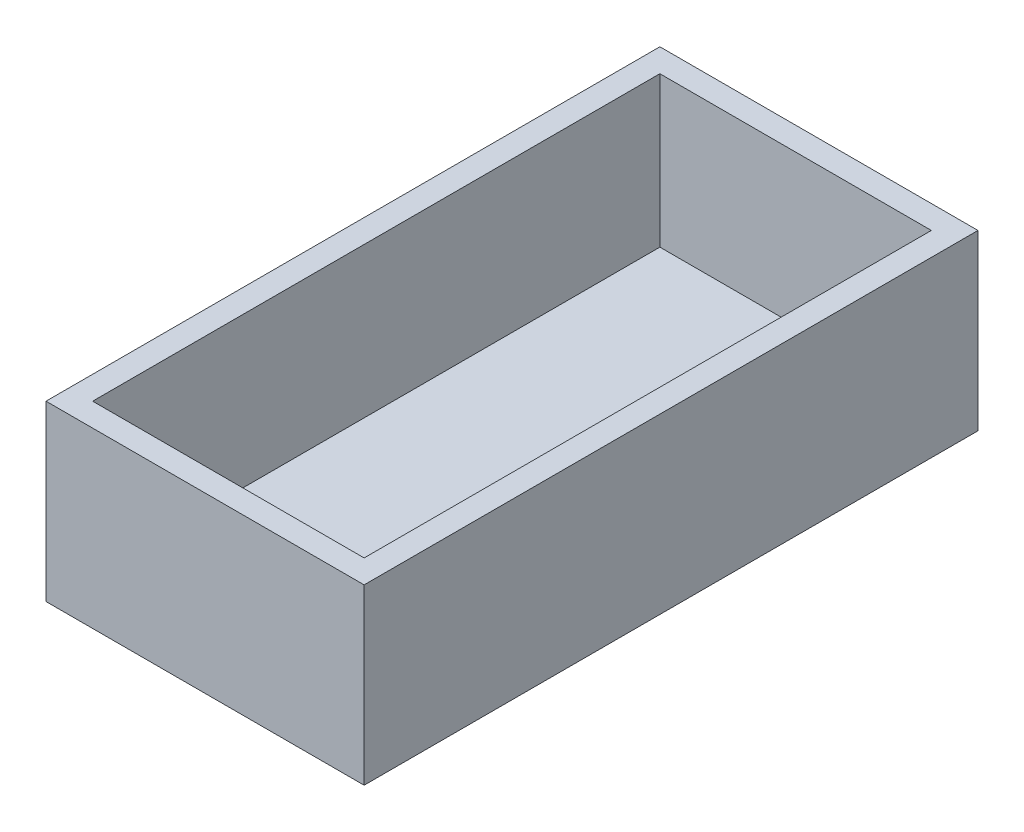
ISO-10303-21;
HEADER;
FILE_DESCRIPTION(('STEP AP214'),'2;1');
FILE_NAME('part.step','',(''),(''),'','','');
FILE_SCHEMA(('AUTOMOTIVE_DESIGN { 1 0 10303 214 1 1 1 1 }'));
ENDSEC;
DATA;
#1=APPLICATION_CONTEXT('core data for automotive mechanical design processes');
#2=APPLICATION_PROTOCOL_DEFINITION('international standard','automotive_design',2000,#1);
#3=PRODUCT_CONTEXT('',#1,'mechanical');
#4=PRODUCT('Part','Part','',(#3));
#5=PRODUCT_RELATED_PRODUCT_CATEGORY('part','',(#4));
#6=PRODUCT_DEFINITION_FORMATION('','',#4);
#7=PRODUCT_DEFINITION_CONTEXT('part definition',#1,'design');
#8=PRODUCT_DEFINITION('design','',#6,#7);
#9=PRODUCT_DEFINITION_SHAPE('','',#8);
#10=(LENGTH_UNIT() NAMED_UNIT(*) SI_UNIT(.MILLI.,.METRE.));
#11=(NAMED_UNIT(*) PLANE_ANGLE_UNIT() SI_UNIT($,.RADIAN.));
#12=(NAMED_UNIT(*) SI_UNIT($,.STERADIAN.) SOLID_ANGLE_UNIT());
#13=UNCERTAINTY_MEASURE_WITH_UNIT(LENGTH_MEASURE(1.E-05),#10,'distance_accuracy_value','');
#14=(GEOMETRIC_REPRESENTATION_CONTEXT(3) GLOBAL_UNCERTAINTY_ASSIGNED_CONTEXT((#13)) GLOBAL_UNIT_ASSIGNED_CONTEXT((#10,
#11,#12)) REPRESENTATION_CONTEXT('',''));
#15=CARTESIAN_POINT('',(0.,0.,0.));
#16=DIRECTION('',(0.,0.,1.));
#17=DIRECTION('',(1.,0.,0.));
#18=AXIS2_PLACEMENT_3D('',#15,#16,#17);
#19=CARTESIAN_POINT('',(0.,23.622,0.));
#20=DIRECTION('',(0.,-1.,0.));
#21=DIRECTION('',(0.,0.,-1.));
#22=AXIS2_PLACEMENT_3D('',#19,#20,#21);
#23=PLANE('',#22);
#24=DIRECTION('',(1.,0.,0.));
#25=VECTOR('',#24,1.);
#26=CARTESIAN_POINT('',(20.066,23.622,41.783));
#27=LINE('',#26,#25);
#28=CARTESIAN_POINT('',(-23.241,23.622,41.783));
#29=VERTEX_POINT('',#28);
#30=CARTESIAN_POINT('',(20.066,23.622,41.783));
#31=VERTEX_POINT('',#30);
#32=EDGE_CURVE('E165',#29,#31,#27,.T.);
#33=ORIENTED_EDGE('',*,*,#32,.T.);
#34=DIRECTION('',(0.,0.,-1.));
#35=VECTOR('',#34,1.);
#36=CARTESIAN_POINT('',(20.066,23.622,41.783));
#37=LINE('',#36,#35);
#38=CARTESIAN_POINT('',(20.066,23.622,-41.783));
#39=VERTEX_POINT('',#38);
#40=EDGE_CURVE('E100',#31,#39,#37,.T.);
#41=ORIENTED_EDGE('',*,*,#40,.T.);
#42=DIRECTION('',(-1.,0.,0.));
#43=VECTOR('',#42,1.);
#44=CARTESIAN_POINT('',(20.066,23.622,-41.783));
#45=LINE('',#44,#43);
#46=CARTESIAN_POINT('',(-23.241,23.622,-41.783));
#47=VERTEX_POINT('',#46);
#48=EDGE_CURVE('E170',#39,#47,#45,.T.);
#49=ORIENTED_EDGE('',*,*,#48,.T.);
#50=DIRECTION('',(0.,0.,1.));
#51=VECTOR('',#50,1.);
#52=CARTESIAN_POINT('',(-23.241,23.622,41.783));
#53=LINE('',#52,#51);
#54=EDGE_CURVE('E72',#47,#29,#53,.T.);
#55=ORIENTED_EDGE('',*,*,#54,.T.);
#56=EDGE_LOOP('',(#33,#41,#49,#55));
#57=FACE_BOUND('',#56,.T.);
#58=DIRECTION('',(1.,0.,0.));
#59=VECTOR('',#58,1.);
#60=CARTESIAN_POINT('',(0.,23.622,38.608));
#61=LINE('',#60,#59);
#62=CARTESIAN_POINT('',(-20.066,23.622,38.608));
#63=VERTEX_POINT('',#62);
#64=CARTESIAN_POINT('',(16.891,23.622,38.608));
#65=VERTEX_POINT('',#64);
#66=EDGE_CURVE('E149',#63,#65,#61,.T.);
#67=ORIENTED_EDGE('',*,*,#66,.F.);
#68=DIRECTION('',(0.,0.,1.));
#69=VECTOR('',#68,1.);
#70=CARTESIAN_POINT('',(-20.066,23.622,0.));
#71=LINE('',#70,#69);
#72=CARTESIAN_POINT('',(-20.066,23.622,-38.608));
#73=VERTEX_POINT('',#72);
#74=EDGE_CURVE('E162',#73,#63,#71,.T.);
#75=ORIENTED_EDGE('',*,*,#74,.F.);
#76=DIRECTION('',(-1.,0.,0.));
#77=VECTOR('',#76,1.);
#78=CARTESIAN_POINT('',(0.,23.622,-38.608));
#79=LINE('',#78,#77);
#80=CARTESIAN_POINT('',(16.891,23.622,-38.608));
#81=VERTEX_POINT('',#80);
#82=EDGE_CURVE('E159',#81,#73,#79,.T.);
#83=ORIENTED_EDGE('',*,*,#82,.F.);
#84=DIRECTION('',(0.,0.,-1.));
#85=VECTOR('',#84,1.);
#86=CARTESIAN_POINT('',(16.891,23.622,0.));
#87=LINE('',#86,#85);
#88=EDGE_CURVE('E138',#65,#81,#87,.T.);
#89=ORIENTED_EDGE('',*,*,#88,.F.);
#90=EDGE_LOOP('',(#67,#75,#83,#89));
#91=FACE_BOUND('',#90,.T.);
#92=ADVANCED_FACE('F47',(#57,#91),#23,.F.);
#93=CARTESIAN_POINT('',(20.066,23.622,41.783));
#94=DIRECTION('',(0.,0.,-1.));
#95=DIRECTION('',(-1.,0.,0.));
#96=AXIS2_PLACEMENT_3D('',#93,#94,#95);
#97=PLANE('',#96);
#98=DIRECTION('',(1.,0.,0.));
#99=VECTOR('',#98,1.);
#100=CARTESIAN_POINT('',(20.066,0.,41.783));
#101=LINE('',#100,#99);
#102=CARTESIAN_POINT('',(-23.241,0.,41.783));
#103=VERTEX_POINT('',#102);
#104=CARTESIAN_POINT('',(20.066,0.,41.783));
#105=VERTEX_POINT('',#104);
#106=EDGE_CURVE('E176',#103,#105,#101,.T.);
#107=ORIENTED_EDGE('',*,*,#106,.T.);
#108=DIRECTION('',(0.,-1.,0.));
#109=VECTOR('',#108,1.);
#110=CARTESIAN_POINT('',(20.066,23.622,41.783));
#111=LINE('',#110,#109);
#112=EDGE_CURVE('E11',#31,#105,#111,.T.);
#113=ORIENTED_EDGE('',*,*,#112,.F.);
#114=ORIENTED_EDGE('',*,*,#32,.F.);
#115=DIRECTION('',(0.,-1.,0.));
#116=VECTOR('',#115,1.);
#117=CARTESIAN_POINT('',(-23.241,23.622,41.783));
#118=LINE('',#117,#116);
#119=EDGE_CURVE('E175',#29,#103,#118,.T.);
#120=ORIENTED_EDGE('',*,*,#119,.T.);
#121=EDGE_LOOP('',(#107,#113,#114,#120));
#122=FACE_BOUND('',#121,.T.);
#123=ADVANCED_FACE('F49',(#122),#97,.F.);
#124=CARTESIAN_POINT('',(20.066,23.622,41.783));
#125=DIRECTION('',(-1.,0.,0.));
#126=DIRECTION('',(0.,0.,1.));
#127=AXIS2_PLACEMENT_3D('',#124,#125,#126);
#128=PLANE('',#127);
#129=DIRECTION('',(0.,0.,-1.));
#130=VECTOR('',#129,1.);
#131=CARTESIAN_POINT('',(20.066,0.,41.783));
#132=LINE('',#131,#130);
#133=CARTESIAN_POINT('',(20.066,0.,-41.783));
#134=VERTEX_POINT('',#133);
#135=EDGE_CURVE('E180',#105,#134,#132,.T.);
#136=ORIENTED_EDGE('',*,*,#135,.T.);
#137=DIRECTION('',(0.,-1.,0.));
#138=VECTOR('',#137,1.);
#139=CARTESIAN_POINT('',(20.066,23.622,-41.783));
#140=LINE('',#139,#138);
#141=EDGE_CURVE('E56',#39,#134,#140,.T.);
#142=ORIENTED_EDGE('',*,*,#141,.F.);
#143=ORIENTED_EDGE('',*,*,#40,.F.);
#144=ORIENTED_EDGE('',*,*,#112,.T.);
#145=EDGE_LOOP('',(#136,#142,#143,#144));
#146=FACE_BOUND('',#145,.T.);
#147=ADVANCED_FACE('F214',(#146),#128,.F.);
#148=CARTESIAN_POINT('',(20.066,23.622,-41.783));
#149=DIRECTION('',(0.,0.,1.));
#150=DIRECTION('',(1.,0.,0.));
#151=AXIS2_PLACEMENT_3D('',#148,#149,#150);
#152=PLANE('',#151);
#153=DIRECTION('',(-1.,0.,0.));
#154=VECTOR('',#153,1.);
#155=CARTESIAN_POINT('',(20.066,0.,-41.783));
#156=LINE('',#155,#154);
#157=CARTESIAN_POINT('',(-23.241,0.,-41.783));
#158=VERTEX_POINT('',#157);
#159=EDGE_CURVE('E183',#134,#158,#156,.T.);
#160=ORIENTED_EDGE('',*,*,#159,.T.);
#161=DIRECTION('',(0.,-1.,0.));
#162=VECTOR('',#161,1.);
#163=CARTESIAN_POINT('',(-23.241,23.622,-41.783));
#164=LINE('',#163,#162);
#165=EDGE_CURVE('E190',#47,#158,#164,.T.);
#166=ORIENTED_EDGE('',*,*,#165,.F.);
#167=ORIENTED_EDGE('',*,*,#48,.F.);
#168=ORIENTED_EDGE('',*,*,#141,.T.);
#169=EDGE_LOOP('',(#160,#166,#167,#168));
#170=FACE_BOUND('',#169,.T.);
#171=ADVANCED_FACE('F197',(#170),#152,.F.);
#172=CARTESIAN_POINT('',(-23.241,23.622,41.783));
#173=DIRECTION('',(1.,0.,0.));
#174=DIRECTION('',(0.,0.,-1.));
#175=AXIS2_PLACEMENT_3D('',#172,#173,#174);
#176=PLANE('',#175);
#177=DIRECTION('',(0.,0.,1.));
#178=VECTOR('',#177,1.);
#179=CARTESIAN_POINT('',(-23.241,0.,41.783));
#180=LINE('',#179,#178);
#181=EDGE_CURVE('E93',#158,#103,#180,.T.);
#182=ORIENTED_EDGE('',*,*,#181,.T.);
#183=ORIENTED_EDGE('',*,*,#119,.F.);
#184=ORIENTED_EDGE('',*,*,#54,.F.);
#185=ORIENTED_EDGE('',*,*,#165,.T.);
#186=EDGE_LOOP('',(#182,#183,#184,#185));
#187=FACE_BOUND('',#186,.T.);
#188=ADVANCED_FACE('F205',(#187),#176,.F.);
#189=CARTESIAN_POINT('',(0.,0.,0.));
#190=DIRECTION('',(0.,-1.,0.));
#191=DIRECTION('',(0.,0.,-1.));
#192=AXIS2_PLACEMENT_3D('',#189,#190,#191);
#193=PLANE('',#192);
#194=ORIENTED_EDGE('',*,*,#106,.F.);
#195=ORIENTED_EDGE('',*,*,#181,.F.);
#196=ORIENTED_EDGE('',*,*,#159,.F.);
#197=ORIENTED_EDGE('',*,*,#135,.F.);
#198=EDGE_LOOP('',(#194,#195,#196,#197));
#199=FACE_BOUND('',#198,.T.);
#200=ADVANCED_FACE('F201',(#199),#193,.T.);
#201=CARTESIAN_POINT('',(20.066,23.622,38.608));
#202=DIRECTION('',(0.,0.,-1.));
#203=DIRECTION('',(-1.,0.,0.));
#204=AXIS2_PLACEMENT_3D('',#201,#202,#203);
#205=PLANE('',#204);
#206=DIRECTION('',(1.,0.,0.));
#207=VECTOR('',#206,1.);
#208=CARTESIAN_POINT('',(0.,3.175,38.608));
#209=LINE('',#208,#207);
#210=CARTESIAN_POINT('',(-20.066,3.175,38.608));
#211=VERTEX_POINT('',#210);
#212=CARTESIAN_POINT('',(16.891,3.175,38.608));
#213=VERTEX_POINT('',#212);
#214=EDGE_CURVE('E128',#211,#213,#209,.T.);
#215=ORIENTED_EDGE('',*,*,#214,.F.);
#216=DIRECTION('',(0.,-1.,0.));
#217=VECTOR('',#216,1.);
#218=CARTESIAN_POINT('',(-20.066,23.622,38.608));
#219=LINE('',#218,#217);
#220=EDGE_CURVE('E153',#63,#211,#219,.T.);
#221=ORIENTED_EDGE('',*,*,#220,.F.);
#222=ORIENTED_EDGE('',*,*,#66,.T.);
#223=DIRECTION('',(0.,-1.,0.));
#224=VECTOR('',#223,1.);
#225=CARTESIAN_POINT('',(16.891,23.622,38.608));
#226=LINE('',#225,#224);
#227=EDGE_CURVE('E142',#65,#213,#226,.T.);
#228=ORIENTED_EDGE('',*,*,#227,.T.);
#229=EDGE_LOOP('',(#215,#221,#222,#228));
#230=FACE_BOUND('',#229,.T.);
#231=ADVANCED_FACE('F212',(#230),#205,.T.);
#232=CARTESIAN_POINT('',(16.891,23.622,41.783));
#233=DIRECTION('',(-1.,0.,0.));
#234=DIRECTION('',(0.,0.,1.));
#235=AXIS2_PLACEMENT_3D('',#232,#233,#234);
#236=PLANE('',#235);
#237=DIRECTION('',(0.,0.,-1.));
#238=VECTOR('',#237,1.);
#239=CARTESIAN_POINT('',(16.891,3.175,0.));
#240=LINE('',#239,#238);
#241=CARTESIAN_POINT('',(16.891,3.175,-38.608));
#242=VERTEX_POINT('',#241);
#243=EDGE_CURVE('E122',#213,#242,#240,.T.);
#244=ORIENTED_EDGE('',*,*,#243,.F.);
#245=ORIENTED_EDGE('',*,*,#227,.F.);
#246=ORIENTED_EDGE('',*,*,#88,.T.);
#247=DIRECTION('',(0.,-1.,0.));
#248=VECTOR('',#247,1.);
#249=CARTESIAN_POINT('',(16.891,23.622,-38.608));
#250=LINE('',#249,#248);
#251=EDGE_CURVE('E135',#81,#242,#250,.T.);
#252=ORIENTED_EDGE('',*,*,#251,.T.);
#253=EDGE_LOOP('',(#244,#245,#246,#252));
#254=FACE_BOUND('',#253,.T.);
#255=ADVANCED_FACE('F136',(#254),#236,.T.);
#256=CARTESIAN_POINT('',(20.066,23.622,-38.608));
#257=DIRECTION('',(0.,0.,1.));
#258=DIRECTION('',(1.,0.,0.));
#259=AXIS2_PLACEMENT_3D('',#256,#257,#258);
#260=PLANE('',#259);
#261=DIRECTION('',(-1.,0.,0.));
#262=VECTOR('',#261,1.);
#263=CARTESIAN_POINT('',(0.,3.175,-38.608));
#264=LINE('',#263,#262);
#265=CARTESIAN_POINT('',(-20.066,3.175,-38.608));
#266=VERTEX_POINT('',#265);
#267=EDGE_CURVE('E126',#242,#266,#264,.T.);
#268=ORIENTED_EDGE('',*,*,#267,.F.);
#269=ORIENTED_EDGE('',*,*,#251,.F.);
#270=ORIENTED_EDGE('',*,*,#82,.T.);
#271=DIRECTION('',(0.,-1.,0.));
#272=VECTOR('',#271,1.);
#273=CARTESIAN_POINT('',(-20.066,23.622,-38.608));
#274=LINE('',#273,#272);
#275=EDGE_CURVE('E63',#73,#266,#274,.T.);
#276=ORIENTED_EDGE('',*,*,#275,.T.);
#277=EDGE_LOOP('',(#268,#269,#270,#276));
#278=FACE_BOUND('',#277,.T.);
#279=ADVANCED_FACE('F144',(#278),#260,.T.);
#280=CARTESIAN_POINT('',(-20.066,23.622,41.783));
#281=DIRECTION('',(1.,0.,0.));
#282=DIRECTION('',(0.,0.,-1.));
#283=AXIS2_PLACEMENT_3D('',#280,#281,#282);
#284=PLANE('',#283);
#285=DIRECTION('',(0.,0.,1.));
#286=VECTOR('',#285,1.);
#287=CARTESIAN_POINT('',(-20.066,3.175,0.));
#288=LINE('',#287,#286);
#289=EDGE_CURVE('E146',#266,#211,#288,.T.);
#290=ORIENTED_EDGE('',*,*,#289,.F.);
#291=ORIENTED_EDGE('',*,*,#275,.F.);
#292=ORIENTED_EDGE('',*,*,#74,.T.);
#293=ORIENTED_EDGE('',*,*,#220,.T.);
#294=EDGE_LOOP('',(#290,#291,#292,#293));
#295=FACE_BOUND('',#294,.T.);
#296=ADVANCED_FACE('F226',(#295),#284,.T.);
#297=CARTESIAN_POINT('',(0.,3.175,0.));
#298=DIRECTION('',(0.,-1.,0.));
#299=DIRECTION('',(0.,0.,-1.));
#300=AXIS2_PLACEMENT_3D('',#297,#298,#299);
#301=PLANE('',#300);
#302=ORIENTED_EDGE('',*,*,#214,.T.);
#303=ORIENTED_EDGE('',*,*,#243,.T.);
#304=ORIENTED_EDGE('',*,*,#267,.T.);
#305=ORIENTED_EDGE('',*,*,#289,.T.);
#306=EDGE_LOOP('',(#302,#303,#304,#305));
#307=FACE_BOUND('',#306,.T.);
#308=ADVANCED_FACE('F124',(#307),#301,.F.);
#309=CLOSED_SHELL('',(#92,#123,#147,#171,#188,#200,#231,#255,#279,#296,#308));
#310=MANIFOLD_SOLID_BREP('B2',#309);
#311=ADVANCED_BREP_SHAPE_REPRESENTATION('',(#18,#310),#14);
#312=SHAPE_DEFINITION_REPRESENTATION(#9,#311);
ENDSEC;
END-ISO-10303-21;
